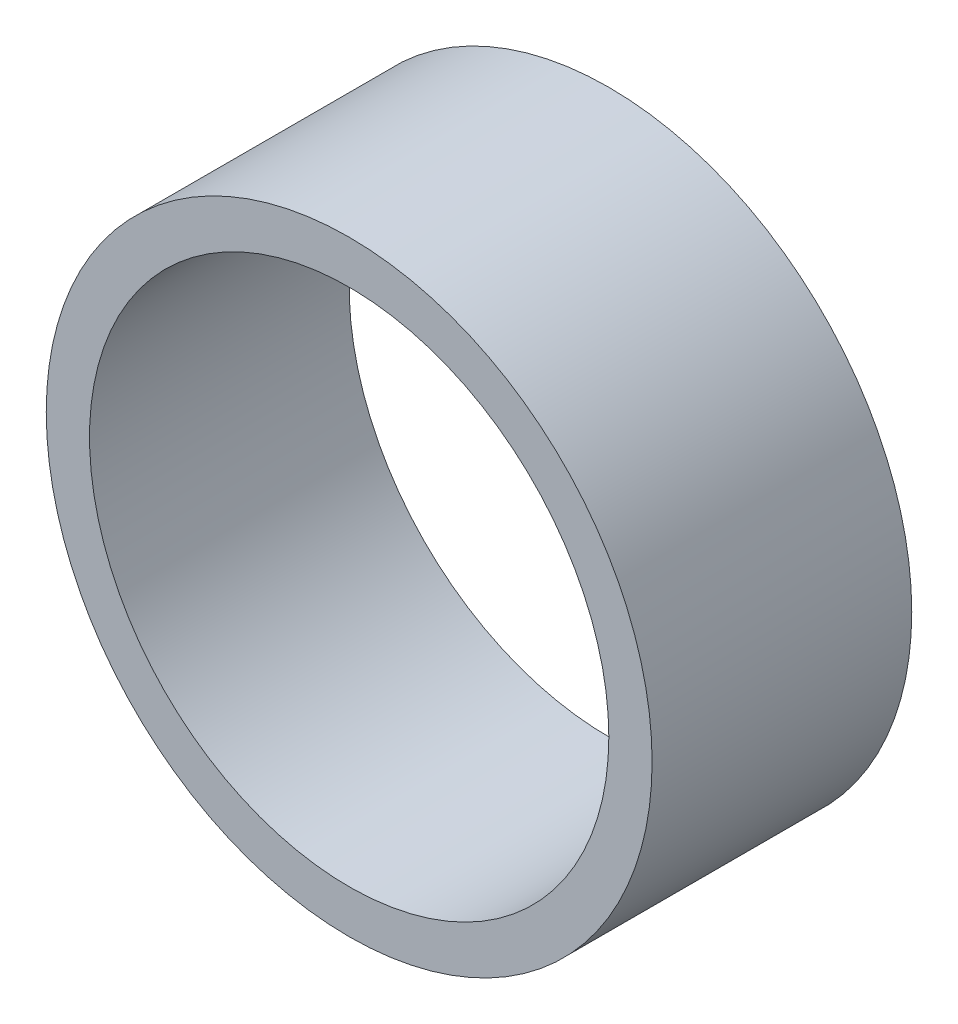
ISO-10303-21;
HEADER;
FILE_DESCRIPTION(('STEP AP214'),'2;1');
FILE_NAME('part.step','',(''),(''),'','','');
FILE_SCHEMA(('AUTOMOTIVE_DESIGN { 1 0 10303 214 1 1 1 1 }'));
ENDSEC;
DATA;
#1=APPLICATION_CONTEXT('core data for automotive mechanical design processes');
#2=APPLICATION_PROTOCOL_DEFINITION('international standard','automotive_design',2000,#1);
#3=PRODUCT_CONTEXT('',#1,'mechanical');
#4=PRODUCT('Part','Part','',(#3));
#5=PRODUCT_RELATED_PRODUCT_CATEGORY('part','',(#4));
#6=PRODUCT_DEFINITION_FORMATION('','',#4);
#7=PRODUCT_DEFINITION_CONTEXT('part definition',#1,'design');
#8=PRODUCT_DEFINITION('design','',#6,#7);
#9=PRODUCT_DEFINITION_SHAPE('','',#8);
#10=(LENGTH_UNIT() NAMED_UNIT(*) SI_UNIT(.MILLI.,.METRE.));
#11=(NAMED_UNIT(*) PLANE_ANGLE_UNIT() SI_UNIT($,.RADIAN.));
#12=(NAMED_UNIT(*) SI_UNIT($,.STERADIAN.) SOLID_ANGLE_UNIT());
#13=UNCERTAINTY_MEASURE_WITH_UNIT(LENGTH_MEASURE(1.E-05),#10,'distance_accuracy_value','');
#14=(GEOMETRIC_REPRESENTATION_CONTEXT(3) GLOBAL_UNCERTAINTY_ASSIGNED_CONTEXT((#13)) GLOBAL_UNIT_ASSIGNED_CONTEXT((#10,
#11,#12)) REPRESENTATION_CONTEXT('',''));
#15=CARTESIAN_POINT('',(0.,0.,0.));
#16=DIRECTION('',(0.,0.,1.));
#17=DIRECTION('',(1.,0.,0.));
#18=AXIS2_PLACEMENT_3D('',#15,#16,#17);
#19=CARTESIAN_POINT('',(0.,0.,15.));
#20=DIRECTION('',(0.,0.,1.));
#21=DIRECTION('',(1.,0.,0.));
#22=AXIS2_PLACEMENT_3D('',#19,#20,#21);
#23=PLANE('',#22);
#24=CARTESIAN_POINT('',(0.,0.,15.));
#25=DIRECTION('',(0.,0.,1.));
#26=DIRECTION('',(1.,0.,0.));
#27=AXIS2_PLACEMENT_3D('',#24,#25,#26);
#28=CIRCLE('',#27,17.5);
#29=CARTESIAN_POINT('',(17.5,0.,15.));
#30=VERTEX_POINT('',#29);
#31=EDGE_CURVE('E10',#30,#30,#28,.T.);
#32=ORIENTED_EDGE('',*,*,#31,.T.);
#33=EDGE_LOOP('',(#32));
#34=FACE_BOUND('',#33,.T.);
#35=CARTESIAN_POINT('',(0.,0.,15.));
#36=DIRECTION('',(0.,0.,1.));
#37=DIRECTION('',(1.,0.,0.));
#38=AXIS2_PLACEMENT_3D('',#35,#36,#37);
#39=CIRCLE('',#38,15.);
#40=CARTESIAN_POINT('',(15.,0.,15.));
#41=VERTEX_POINT('',#40);
#42=EDGE_CURVE('E46',#41,#41,#39,.T.);
#43=ORIENTED_EDGE('',*,*,#42,.F.);
#44=EDGE_LOOP('',(#43));
#45=FACE_BOUND('',#44,.T.);
#46=ADVANCED_FACE('F35',(#34,#45),#23,.T.);
#47=CARTESIAN_POINT('',(0.,0.,0.));
#48=DIRECTION('',(0.,0.,1.));
#49=DIRECTION('',(1.,0.,0.));
#50=AXIS2_PLACEMENT_3D('',#47,#48,#49);
#51=PLANE('',#50);
#52=CARTESIAN_POINT('',(0.,0.,0.));
#53=DIRECTION('',(0.,0.,1.));
#54=DIRECTION('',(1.,0.,0.));
#55=AXIS2_PLACEMENT_3D('',#52,#53,#54);
#56=CIRCLE('',#55,17.5);
#57=CARTESIAN_POINT('',(17.5,0.,0.));
#58=VERTEX_POINT('',#57);
#59=EDGE_CURVE('E39',#58,#58,#56,.T.);
#60=ORIENTED_EDGE('',*,*,#59,.F.);
#61=EDGE_LOOP('',(#60));
#62=FACE_BOUND('',#61,.T.);
#63=CARTESIAN_POINT('',(0.,0.,0.));
#64=DIRECTION('',(0.,0.,1.));
#65=DIRECTION('',(1.,0.,0.));
#66=AXIS2_PLACEMENT_3D('',#63,#64,#65);
#67=CIRCLE('',#66,15.);
#68=CARTESIAN_POINT('',(15.,0.,0.));
#69=VERTEX_POINT('',#68);
#70=EDGE_CURVE('E48',#69,#69,#67,.T.);
#71=ORIENTED_EDGE('',*,*,#70,.T.);
#72=EDGE_LOOP('',(#71));
#73=FACE_BOUND('',#72,.T.);
#74=ADVANCED_FACE('F58',(#62,#73),#51,.F.);
#75=CARTESIAN_POINT('',(0.,0.,15.));
#76=DIRECTION('',(0.,0.,-1.));
#77=DIRECTION('',(-1.,0.,0.));
#78=AXIS2_PLACEMENT_3D('',#75,#76,#77);
#79=CYLINDRICAL_SURFACE('',#78,17.5);
#80=ORIENTED_EDGE('',*,*,#31,.F.);
#81=EDGE_LOOP('',(#80));
#82=FACE_BOUND('',#81,.T.);
#83=ORIENTED_EDGE('',*,*,#59,.T.);
#84=EDGE_LOOP('',(#83));
#85=FACE_BOUND('',#84,.T.);
#86=ADVANCED_FACE('F37',(#82,#85),#79,.T.);
#87=CARTESIAN_POINT('',(0.,0.,15.));
#88=DIRECTION('',(0.,0.,-1.));
#89=DIRECTION('',(-1.,0.,0.));
#90=AXIS2_PLACEMENT_3D('',#87,#88,#89);
#91=CYLINDRICAL_SURFACE('',#90,15.);
#92=ORIENTED_EDGE('',*,*,#42,.T.);
#93=EDGE_LOOP('',(#92));
#94=FACE_BOUND('',#93,.T.);
#95=ORIENTED_EDGE('',*,*,#70,.F.);
#96=EDGE_LOOP('',(#95));
#97=FACE_BOUND('',#96,.T.);
#98=ADVANCED_FACE('F54',(#94,#97),#91,.F.);
#99=CLOSED_SHELL('',(#46,#74,#86,#98));
#100=MANIFOLD_SOLID_BREP('B2',#99);
#101=ADVANCED_BREP_SHAPE_REPRESENTATION('',(#18,#100),#14);
#102=SHAPE_DEFINITION_REPRESENTATION(#9,#101);
ENDSEC;
END-ISO-10303-21;
